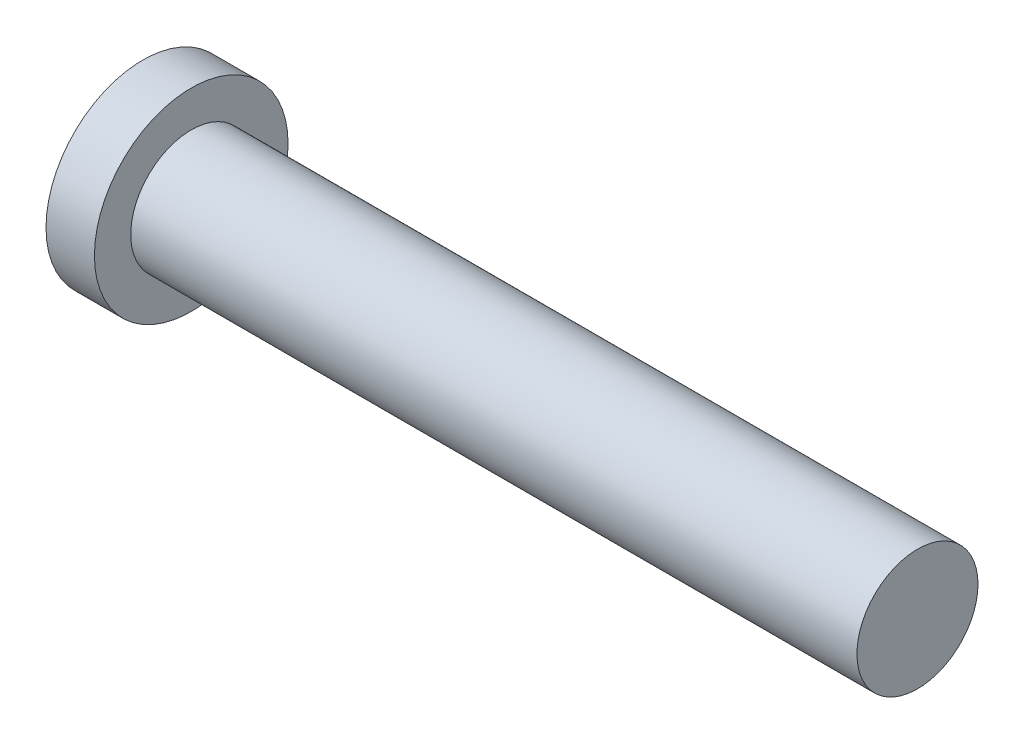
ISO-10303-21;
HEADER;
FILE_DESCRIPTION(('STEP AP214'),'2;1');
FILE_NAME('part.step','',(''),(''),'','','');
FILE_SCHEMA(('AUTOMOTIVE_DESIGN { 1 0 10303 214 1 1 1 1 }'));
ENDSEC;
DATA;
#1=APPLICATION_CONTEXT('core data for automotive mechanical design processes');
#2=APPLICATION_PROTOCOL_DEFINITION('international standard','automotive_design',2000,#1);
#3=PRODUCT_CONTEXT('',#1,'mechanical');
#4=PRODUCT('Part','Part','',(#3));
#5=PRODUCT_RELATED_PRODUCT_CATEGORY('part','',(#4));
#6=PRODUCT_DEFINITION_FORMATION('','',#4);
#7=PRODUCT_DEFINITION_CONTEXT('part definition',#1,'design');
#8=PRODUCT_DEFINITION('design','',#6,#7);
#9=PRODUCT_DEFINITION_SHAPE('','',#8);
#10=(LENGTH_UNIT() NAMED_UNIT(*) SI_UNIT(.MILLI.,.METRE.));
#11=(NAMED_UNIT(*) PLANE_ANGLE_UNIT() SI_UNIT($,.RADIAN.));
#12=(NAMED_UNIT(*) SI_UNIT($,.STERADIAN.) SOLID_ANGLE_UNIT());
#13=UNCERTAINTY_MEASURE_WITH_UNIT(LENGTH_MEASURE(1.E-05),#10,'distance_accuracy_value','');
#14=(GEOMETRIC_REPRESENTATION_CONTEXT(3) GLOBAL_UNCERTAINTY_ASSIGNED_CONTEXT((#13)) GLOBAL_UNIT_ASSIGNED_CONTEXT((#10,
#11,#12)) REPRESENTATION_CONTEXT('',''));
#15=CARTESIAN_POINT('',(0.,0.,0.));
#16=DIRECTION('',(0.,0.,1.));
#17=DIRECTION('',(1.,0.,0.));
#18=AXIS2_PLACEMENT_3D('',#15,#16,#17);
#19=CARTESIAN_POINT('',(30.,0.,0.));
#20=DIRECTION('',(-1.,0.,0.));
#21=DIRECTION('',(0.,0.,1.));
#22=AXIS2_PLACEMENT_3D('',#19,#20,#21);
#23=CYLINDRICAL_SURFACE('',#22,2.5);
#24=CARTESIAN_POINT('',(30.,0.,0.));
#25=DIRECTION('',(1.,0.,0.));
#26=DIRECTION('',(0.,0.,-1.));
#27=AXIS2_PLACEMENT_3D('',#24,#25,#26);
#28=CIRCLE('',#27,2.5);
#29=CARTESIAN_POINT('',(30.,0.,-2.5));
#30=VERTEX_POINT('',#29);
#31=EDGE_CURVE('E10',#30,#30,#28,.T.);
#32=ORIENTED_EDGE('',*,*,#31,.F.);
#33=EDGE_LOOP('',(#32));
#34=FACE_BOUND('',#33,.T.);
#35=CARTESIAN_POINT('',(0.,0.,0.));
#36=DIRECTION('',(1.,0.,0.));
#37=DIRECTION('',(0.,0.,-1.));
#38=AXIS2_PLACEMENT_3D('',#35,#36,#37);
#39=CIRCLE('',#38,2.5);
#40=CARTESIAN_POINT('',(0.,0.,-2.5));
#41=VERTEX_POINT('',#40);
#42=EDGE_CURVE('E46',#41,#41,#39,.T.);
#43=ORIENTED_EDGE('',*,*,#42,.T.);
#44=EDGE_LOOP('',(#43));
#45=FACE_BOUND('',#44,.T.);
#46=ADVANCED_FACE('F43',(#34,#45),#23,.T.);
#47=CARTESIAN_POINT('',(30.,0.,0.));
#48=DIRECTION('',(1.,0.,0.));
#49=DIRECTION('',(0.,0.,-1.));
#50=AXIS2_PLACEMENT_3D('',#47,#48,#49);
#51=PLANE('',#50);
#52=ORIENTED_EDGE('',*,*,#31,.T.);
#53=EDGE_LOOP('',(#52));
#54=FACE_BOUND('',#53,.T.);
#55=ADVANCED_FACE('F70',(#54),#51,.T.);
#56=CARTESIAN_POINT('',(-2.,0.,0.));
#57=DIRECTION('',(1.,0.,0.));
#58=DIRECTION('',(0.,0.,-1.));
#59=AXIS2_PLACEMENT_3D('',#56,#57,#58);
#60=CYLINDRICAL_SURFACE('',#59,4.);
#61=CARTESIAN_POINT('',(-2.,0.,0.));
#62=DIRECTION('',(-1.,0.,0.));
#63=DIRECTION('',(0.,0.,1.));
#64=AXIS2_PLACEMENT_3D('',#61,#62,#63);
#65=CIRCLE('',#64,4.);
#66=CARTESIAN_POINT('',(-2.,0.,4.));
#67=VERTEX_POINT('',#66);
#68=EDGE_CURVE('E55',#67,#67,#65,.T.);
#69=ORIENTED_EDGE('',*,*,#68,.F.);
#70=EDGE_LOOP('',(#69));
#71=FACE_BOUND('',#70,.T.);
#72=CARTESIAN_POINT('',(0.,0.,0.));
#73=DIRECTION('',(-1.,0.,0.));
#74=DIRECTION('',(0.,0.,1.));
#75=AXIS2_PLACEMENT_3D('',#72,#73,#74);
#76=CIRCLE('',#75,4.);
#77=CARTESIAN_POINT('',(0.,0.,4.));
#78=VERTEX_POINT('',#77);
#79=EDGE_CURVE('E57',#78,#78,#76,.T.);
#80=ORIENTED_EDGE('',*,*,#79,.T.);
#81=EDGE_LOOP('',(#80));
#82=FACE_BOUND('',#81,.T.);
#83=ADVANCED_FACE('F67',(#71,#82),#60,.T.);
#84=CARTESIAN_POINT('',(-2.,0.,0.));
#85=DIRECTION('',(-1.,0.,0.));
#86=DIRECTION('',(0.,0.,1.));
#87=AXIS2_PLACEMENT_3D('',#84,#85,#86);
#88=PLANE('',#87);
#89=ORIENTED_EDGE('',*,*,#68,.T.);
#90=EDGE_LOOP('',(#89));
#91=FACE_BOUND('',#90,.T.);
#92=ADVANCED_FACE('F65',(#91),#88,.T.);
#93=CARTESIAN_POINT('',(0.,0.,0.));
#94=DIRECTION('',(-1.,0.,0.));
#95=DIRECTION('',(0.,0.,1.));
#96=AXIS2_PLACEMENT_3D('',#93,#94,#95);
#97=PLANE('',#96);
#98=ORIENTED_EDGE('',*,*,#42,.F.);
#99=EDGE_LOOP('',(#98));
#100=FACE_BOUND('',#99,.T.);
#101=ORIENTED_EDGE('',*,*,#79,.F.);
#102=EDGE_LOOP('',(#101));
#103=FACE_BOUND('',#102,.T.);
#104=ADVANCED_FACE('F74',(#100,#103),#97,.F.);
#105=CLOSED_SHELL('',(#46,#55,#83,#92,#104));
#106=MANIFOLD_SOLID_BREP('B2',#105);
#107=ADVANCED_BREP_SHAPE_REPRESENTATION('',(#18,#106),#14);
#108=SHAPE_DEFINITION_REPRESENTATION(#9,#107);
ENDSEC;
END-ISO-10303-21;
